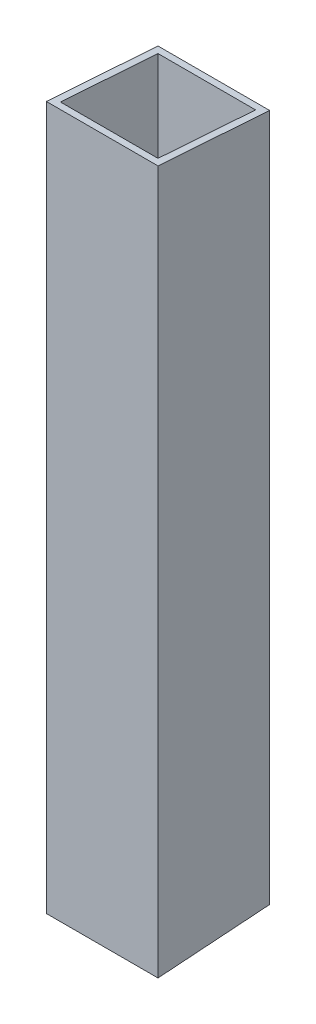
ISO-10303-21;
HEADER;
FILE_DESCRIPTION(('STEP AP214'),'2;1');
FILE_NAME('part.step','',(''),(''),'','','');
FILE_SCHEMA(('AUTOMOTIVE_DESIGN { 1 0 10303 214 1 1 1 1 }'));
ENDSEC;
DATA;
#1=APPLICATION_CONTEXT('core data for automotive mechanical design processes');
#2=APPLICATION_PROTOCOL_DEFINITION('international standard','automotive_design',2000,#1);
#3=PRODUCT_CONTEXT('',#1,'mechanical');
#4=PRODUCT('Part','Part','',(#3));
#5=PRODUCT_RELATED_PRODUCT_CATEGORY('part','',(#4));
#6=PRODUCT_DEFINITION_FORMATION('','',#4);
#7=PRODUCT_DEFINITION_CONTEXT('part definition',#1,'design');
#8=PRODUCT_DEFINITION('design','',#6,#7);
#9=PRODUCT_DEFINITION_SHAPE('','',#8);
#10=(LENGTH_UNIT() NAMED_UNIT(*) SI_UNIT(.MILLI.,.METRE.));
#11=(NAMED_UNIT(*) PLANE_ANGLE_UNIT() SI_UNIT($,.RADIAN.));
#12=(NAMED_UNIT(*) SI_UNIT($,.STERADIAN.) SOLID_ANGLE_UNIT());
#13=UNCERTAINTY_MEASURE_WITH_UNIT(LENGTH_MEASURE(1.E-05),#10,'distance_accuracy_value','');
#14=(GEOMETRIC_REPRESENTATION_CONTEXT(3) GLOBAL_UNCERTAINTY_ASSIGNED_CONTEXT((#13)) GLOBAL_UNIT_ASSIGNED_CONTEXT((#10,
#11,#12)) REPRESENTATION_CONTEXT('',''));
#15=CARTESIAN_POINT('',(0.,0.,0.));
#16=DIRECTION('',(0.,0.,1.));
#17=DIRECTION('',(1.,0.,0.));
#18=AXIS2_PLACEMENT_3D('',#15,#16,#17);
#19=CARTESIAN_POINT('',(-8.325,120.,-8.325));
#20=DIRECTION('',(1.,0.,0.));
#21=DIRECTION('',(0.,0.,-1.));
#22=AXIS2_PLACEMENT_3D('',#19,#20,#21);
#23=PLANE('',#22);
#24=DIRECTION('',(0.,-0.0697564737441183,-0.997564050259825));
#25=VECTOR('',#24,1.);
#26=CARTESIAN_POINT('',(-8.325,118.757880073932,-8.23814251351854));
#27=LINE('',#26,#25);
#28=CARTESIAN_POINT('',(-8.325,119.916087825668,8.325));
#29=VERTEX_POINT('',#28);
#30=CARTESIAN_POINT('',(-8.325,118.751806406808,-8.325));
#31=VERTEX_POINT('',#30);
#32=EDGE_CURVE('E11',#29,#31,#27,.T.);
#33=ORIENTED_EDGE('',*,*,#32,.F.);
#34=DIRECTION('',(0.,-1.,0.));
#35=VECTOR('',#34,1.);
#36=CARTESIAN_POINT('',(-8.325,120.,8.325));
#37=LINE('',#36,#35);
#38=CARTESIAN_POINT('',(-8.325,0.0839121743321965,8.325));
#39=VERTEX_POINT('',#38);
#40=EDGE_CURVE('E155',#29,#39,#37,.T.);
#41=ORIENTED_EDGE('',*,*,#40,.T.);
#42=DIRECTION('',(0.,-0.0697564737441183,0.997564050259825));
#43=VECTOR('',#42,1.);
#44=CARTESIAN_POINT('',(-8.325,1.82603580157412,-16.5885285711216));
#45=LINE('',#44,#43);
#46=CARTESIAN_POINT('',(-8.325,1.24819359319153,-8.325));
#47=VERTEX_POINT('',#46);
#48=EDGE_CURVE('E48',#47,#39,#45,.T.);
#49=ORIENTED_EDGE('',*,*,#48,.F.);
#50=DIRECTION('',(0.,-1.,0.));
#51=VECTOR('',#50,1.);
#52=CARTESIAN_POINT('',(-8.325,120.,-8.325));
#53=LINE('',#52,#51);
#54=EDGE_CURVE('E163',#31,#47,#53,.T.);
#55=ORIENTED_EDGE('',*,*,#54,.F.);
#56=EDGE_LOOP('',(#33,#41,#49,#55));
#57=FACE_BOUND('',#56,.T.);
#58=ADVANCED_FACE('F39',(#57),#23,.T.);
#59=CARTESIAN_POINT('',(8.325,120.,-8.325));
#60=DIRECTION('',(0.,0.,1.));
#61=DIRECTION('',(1.,0.,0.));
#62=AXIS2_PLACEMENT_3D('',#59,#60,#61);
#63=PLANE('',#62);
#64=DIRECTION('',(1.,0.,0.));
#65=VECTOR('',#64,1.);
#66=CARTESIAN_POINT('',(8.325,118.751806406808,-8.325));
#67=LINE('',#66,#65);
#68=CARTESIAN_POINT('',(8.325,118.751806406808,-8.325));
#69=VERTEX_POINT('',#68);
#70=EDGE_CURVE('E159',#31,#69,#67,.T.);
#71=ORIENTED_EDGE('',*,*,#70,.F.);
#72=ORIENTED_EDGE('',*,*,#54,.T.);
#73=DIRECTION('',(-1.,0.,0.));
#74=VECTOR('',#73,1.);
#75=CARTESIAN_POINT('',(8.325,1.24819359319153,-8.325));
#76=LINE('',#75,#74);
#77=CARTESIAN_POINT('',(8.325,1.24819359319153,-8.325));
#78=VERTEX_POINT('',#77);
#79=EDGE_CURVE('E62',#78,#47,#76,.T.);
#80=ORIENTED_EDGE('',*,*,#79,.F.);
#81=DIRECTION('',(0.,-1.,0.));
#82=VECTOR('',#81,1.);
#83=CARTESIAN_POINT('',(8.325,120.,-8.325));
#84=LINE('',#83,#82);
#85=EDGE_CURVE('E167',#69,#78,#84,.T.);
#86=ORIENTED_EDGE('',*,*,#85,.F.);
#87=EDGE_LOOP('',(#71,#72,#80,#86));
#88=FACE_BOUND('',#87,.T.);
#89=ADVANCED_FACE('F184',(#88),#63,.T.);
#90=CARTESIAN_POINT('',(8.325,120.,8.325));
#91=DIRECTION('',(-1.,0.,0.));
#92=DIRECTION('',(0.,0.,1.));
#93=AXIS2_PLACEMENT_3D('',#90,#91,#92);
#94=PLANE('',#93);
#95=DIRECTION('',(0.,0.0697564737441183,0.997564050259825));
#96=VECTOR('',#95,1.);
#97=CARTESIAN_POINT('',(8.325,119.916496139424,8.33083915875506));
#98=LINE('',#97,#96);
#99=CARTESIAN_POINT('',(8.325,119.916087825668,8.325));
#100=VERTEX_POINT('',#99);
#101=EDGE_CURVE('E169',#69,#100,#98,.T.);
#102=ORIENTED_EDGE('',*,*,#101,.F.);
#103=ORIENTED_EDGE('',*,*,#85,.T.);
#104=DIRECTION('',(0.,0.0697564737441183,-0.997564050259825));
#105=VECTOR('',#104,1.);
#106=CARTESIAN_POINT('',(8.325,0.667419736081684,-0.0195468988480364));
#107=LINE('',#106,#105);
#108=CARTESIAN_POINT('',(8.325,0.0839121743321934,8.325));
#109=VERTEX_POINT('',#108);
#110=EDGE_CURVE('E160',#109,#78,#107,.T.);
#111=ORIENTED_EDGE('',*,*,#110,.F.);
#112=DIRECTION('',(0.,-1.,0.));
#113=VECTOR('',#112,1.);
#114=CARTESIAN_POINT('',(8.325,120.,8.325));
#115=LINE('',#114,#113);
#116=EDGE_CURVE('E157',#100,#109,#115,.T.);
#117=ORIENTED_EDGE('',*,*,#116,.F.);
#118=EDGE_LOOP('',(#102,#103,#111,#117));
#119=FACE_BOUND('',#118,.T.);
#120=ADVANCED_FACE('F181',(#119),#94,.T.);
#121=CARTESIAN_POINT('',(-8.325,120.,8.325));
#122=DIRECTION('',(0.,0.,-1.));
#123=DIRECTION('',(-1.,0.,0.));
#124=AXIS2_PLACEMENT_3D('',#121,#122,#123);
#125=PLANE('',#124);
#126=DIRECTION('',(-1.,0.,0.));
#127=VECTOR('',#126,1.);
#128=CARTESIAN_POINT('',(-8.325,119.916087825668,8.325));
#129=LINE('',#128,#127);
#130=EDGE_CURVE('E54',#100,#29,#129,.T.);
#131=ORIENTED_EDGE('',*,*,#130,.F.);
#132=ORIENTED_EDGE('',*,*,#116,.T.);
#133=DIRECTION('',(1.,0.,0.));
#134=VECTOR('',#133,1.);
#135=CARTESIAN_POINT('',(-8.325,0.083912174332193,8.325));
#136=LINE('',#135,#134);
#137=EDGE_CURVE('E145',#39,#109,#136,.T.);
#138=ORIENTED_EDGE('',*,*,#137,.F.);
#139=ORIENTED_EDGE('',*,*,#40,.F.);
#140=EDGE_LOOP('',(#131,#132,#138,#139));
#141=FACE_BOUND('',#140,.T.);
#142=ADVANCED_FACE('F154',(#141),#125,.T.);
#143=CARTESIAN_POINT('',(-9.525,0.,9.525));
#144=DIRECTION('',(0.,0.997564050259825,0.0697564737441183));
#145=DIRECTION('',(0.,-0.0697564737441183,0.997564050259825));
#146=AXIS2_PLACEMENT_3D('',#143,#144,#145);
#147=PLANE('',#146);
#148=ORIENTED_EDGE('',*,*,#137,.T.);
#149=ORIENTED_EDGE('',*,*,#110,.T.);
#150=ORIENTED_EDGE('',*,*,#79,.T.);
#151=ORIENTED_EDGE('',*,*,#48,.T.);
#152=EDGE_LOOP('',(#148,#149,#150,#151));
#153=FACE_BOUND('',#152,.T.);
#154=DIRECTION('',(1.,0.,0.));
#155=VECTOR('',#154,1.);
#156=CARTESIAN_POINT('',(-9.525,0.,9.525));
#157=LINE('',#156,#155);
#158=CARTESIAN_POINT('',(-9.525,0.,9.525));
#159=VERTEX_POINT('',#158);
#160=CARTESIAN_POINT('',(9.525,0.,9.525));
#161=VERTEX_POINT('',#160);
#162=EDGE_CURVE('E116',#159,#161,#157,.T.);
#163=ORIENTED_EDGE('',*,*,#162,.F.);
#164=DIRECTION('',(0.,-0.0697564737441183,0.997564050259825));
#165=VECTOR('',#164,1.);
#166=CARTESIAN_POINT('',(-9.525,0.,9.525));
#167=LINE('',#166,#165);
#168=CARTESIAN_POINT('',(-9.525,1.33210576752374,-9.525));
#169=VERTEX_POINT('',#168);
#170=EDGE_CURVE('E228',#169,#159,#167,.T.);
#171=ORIENTED_EDGE('',*,*,#170,.F.);
#172=DIRECTION('',(1.,0.,0.));
#173=VECTOR('',#172,1.);
#174=CARTESIAN_POINT('',(-9.525,1.33210576752374,-9.525));
#175=LINE('',#174,#173);
#176=CARTESIAN_POINT('',(9.525,1.33210576752374,-9.525));
#177=VERTEX_POINT('',#176);
#178=EDGE_CURVE('E125',#169,#177,#175,.T.);
#179=ORIENTED_EDGE('',*,*,#178,.T.);
#180=DIRECTION('',(0.,-0.0697564737441183,0.997564050259825));
#181=VECTOR('',#180,1.);
#182=CARTESIAN_POINT('',(9.525,0.,9.525));
#183=LINE('',#182,#181);
#184=EDGE_CURVE('E232',#177,#161,#183,.T.);
#185=ORIENTED_EDGE('',*,*,#184,.T.);
#186=EDGE_LOOP('',(#163,#171,#179,#185));
#187=FACE_BOUND('',#186,.T.);
#188=ADVANCED_FACE('F143',(#153,#187),#147,.F.);
#189=CARTESIAN_POINT('',(-9.525,120.,9.525));
#190=DIRECTION('',(0.,-0.997564050259825,0.0697564737441183));
#191=DIRECTION('',(0.,-0.0697564737441183,-0.997564050259825));
#192=AXIS2_PLACEMENT_3D('',#189,#190,#191);
#193=PLANE('',#192);
#194=ORIENTED_EDGE('',*,*,#130,.T.);
#195=ORIENTED_EDGE('',*,*,#32,.T.);
#196=ORIENTED_EDGE('',*,*,#70,.T.);
#197=ORIENTED_EDGE('',*,*,#101,.T.);
#198=EDGE_LOOP('',(#194,#195,#196,#197));
#199=FACE_BOUND('',#198,.T.);
#200=DIRECTION('',(1.,0.,0.));
#201=VECTOR('',#200,1.);
#202=CARTESIAN_POINT('',(-9.525,118.667894232476,-9.525));
#203=LINE('',#202,#201);
#204=CARTESIAN_POINT('',(-9.525,118.667894232476,-9.525));
#205=VERTEX_POINT('',#204);
#206=CARTESIAN_POINT('',(9.525,118.667894232476,-9.525));
#207=VERTEX_POINT('',#206);
#208=EDGE_CURVE('E186',#205,#207,#203,.T.);
#209=ORIENTED_EDGE('',*,*,#208,.F.);
#210=DIRECTION('',(0.,-0.0697564737441183,-0.997564050259825));
#211=VECTOR('',#210,1.);
#212=CARTESIAN_POINT('',(-9.525,120.,9.525));
#213=LINE('',#212,#211);
#214=CARTESIAN_POINT('',(-9.525,120.,9.525));
#215=VERTEX_POINT('',#214);
#216=EDGE_CURVE('E109',#215,#205,#213,.T.);
#217=ORIENTED_EDGE('',*,*,#216,.F.);
#218=DIRECTION('',(1.,0.,0.));
#219=VECTOR('',#218,1.);
#220=CARTESIAN_POINT('',(-9.525,120.,9.525));
#221=LINE('',#220,#219);
#222=CARTESIAN_POINT('',(9.525,120.,9.525));
#223=VERTEX_POINT('',#222);
#224=EDGE_CURVE('E103',#215,#223,#221,.T.);
#225=ORIENTED_EDGE('',*,*,#224,.T.);
#226=DIRECTION('',(0.,-0.0697564737441183,-0.997564050259825));
#227=VECTOR('',#226,1.);
#228=CARTESIAN_POINT('',(9.525,120.,9.525));
#229=LINE('',#228,#227);
#230=EDGE_CURVE('E106',#223,#207,#229,.T.);
#231=ORIENTED_EDGE('',*,*,#230,.T.);
#232=EDGE_LOOP('',(#209,#217,#225,#231));
#233=FACE_BOUND('',#232,.T.);
#234=ADVANCED_FACE('F105',(#199,#233),#193,.F.);
#235=CARTESIAN_POINT('',(9.525,120.,9.525));
#236=DIRECTION('',(-1.,0.,0.));
#237=DIRECTION('',(0.,0.,1.));
#238=AXIS2_PLACEMENT_3D('',#235,#236,#237);
#239=PLANE('',#238);
#240=DIRECTION('',(0.,-1.,0.));
#241=VECTOR('',#240,1.);
#242=CARTESIAN_POINT('',(9.525,120.,-9.525));
#243=LINE('',#242,#241);
#244=EDGE_CURVE('E123',#207,#177,#243,.T.);
#245=ORIENTED_EDGE('',*,*,#244,.F.);
#246=ORIENTED_EDGE('',*,*,#230,.F.);
#247=DIRECTION('',(0.,-1.,0.));
#248=VECTOR('',#247,1.);
#249=CARTESIAN_POINT('',(9.525,120.,9.525));
#250=LINE('',#249,#248);
#251=EDGE_CURVE('E115',#223,#161,#250,.T.);
#252=ORIENTED_EDGE('',*,*,#251,.T.);
#253=ORIENTED_EDGE('',*,*,#184,.F.);
#254=EDGE_LOOP('',(#245,#246,#252,#253));
#255=FACE_BOUND('',#254,.T.);
#256=ADVANCED_FACE('F41',(#255),#239,.F.);
#257=CARTESIAN_POINT('',(-9.525,120.,-9.525));
#258=DIRECTION('',(0.,0.,1.));
#259=DIRECTION('',(1.,0.,0.));
#260=AXIS2_PLACEMENT_3D('',#257,#258,#259);
#261=PLANE('',#260);
#262=DIRECTION('',(0.,-1.,0.));
#263=VECTOR('',#262,1.);
#264=CARTESIAN_POINT('',(-9.525,120.,-9.525));
#265=LINE('',#264,#263);
#266=EDGE_CURVE('E133',#205,#169,#265,.T.);
#267=ORIENTED_EDGE('',*,*,#266,.F.);
#268=ORIENTED_EDGE('',*,*,#208,.T.);
#269=ORIENTED_EDGE('',*,*,#244,.T.);
#270=ORIENTED_EDGE('',*,*,#178,.F.);
#271=EDGE_LOOP('',(#267,#268,#269,#270));
#272=FACE_BOUND('',#271,.T.);
#273=ADVANCED_FACE('F203',(#272),#261,.F.);
#274=CARTESIAN_POINT('',(-9.525,120.,9.525));
#275=DIRECTION('',(1.,0.,0.));
#276=DIRECTION('',(0.,0.,-1.));
#277=AXIS2_PLACEMENT_3D('',#274,#275,#276);
#278=PLANE('',#277);
#279=DIRECTION('',(0.,-1.,0.));
#280=VECTOR('',#279,1.);
#281=CARTESIAN_POINT('',(-9.525,120.,9.525));
#282=LINE('',#281,#280);
#283=EDGE_CURVE('E130',#215,#159,#282,.T.);
#284=ORIENTED_EDGE('',*,*,#283,.F.);
#285=ORIENTED_EDGE('',*,*,#216,.T.);
#286=ORIENTED_EDGE('',*,*,#266,.T.);
#287=ORIENTED_EDGE('',*,*,#170,.T.);
#288=EDGE_LOOP('',(#284,#285,#286,#287));
#289=FACE_BOUND('',#288,.T.);
#290=ADVANCED_FACE('F218',(#289),#278,.F.);
#291=CARTESIAN_POINT('',(-9.525,120.,9.525));
#292=DIRECTION('',(0.,0.,-1.));
#293=DIRECTION('',(-1.,0.,0.));
#294=AXIS2_PLACEMENT_3D('',#291,#292,#293);
#295=PLANE('',#294);
#296=ORIENTED_EDGE('',*,*,#162,.T.);
#297=ORIENTED_EDGE('',*,*,#251,.F.);
#298=ORIENTED_EDGE('',*,*,#224,.F.);
#299=ORIENTED_EDGE('',*,*,#283,.T.);
#300=EDGE_LOOP('',(#296,#297,#298,#299));
#301=FACE_BOUND('',#300,.T.);
#302=ADVANCED_FACE('F128',(#301),#295,.F.);
#303=CLOSED_SHELL('',(#58,#89,#120,#142,#188,#234,#256,#273,#290,#302));
#304=MANIFOLD_SOLID_BREP('B2',#303);
#305=ADVANCED_BREP_SHAPE_REPRESENTATION('',(#18,#304),#14);
#306=SHAPE_DEFINITION_REPRESENTATION(#9,#305);
ENDSEC;
END-ISO-10303-21;
